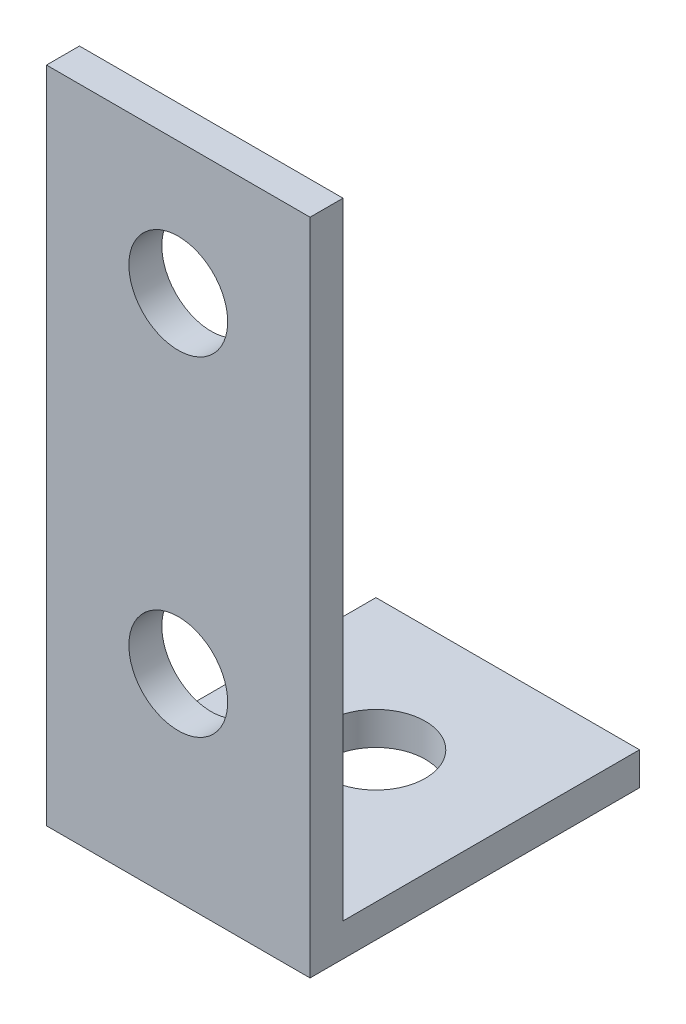
ISO-10303-21;
HEADER;
FILE_DESCRIPTION(('STEP AP214'),'2;1');
FILE_NAME('part.step','',(''),(''),'','','');
FILE_SCHEMA(('AUTOMOTIVE_DESIGN { 1 0 10303 214 1 1 1 1 }'));
ENDSEC;
DATA;
#1=APPLICATION_CONTEXT('core data for automotive mechanical design processes');
#2=APPLICATION_PROTOCOL_DEFINITION('international standard','automotive_design',2000,#1);
#3=PRODUCT_CONTEXT('',#1,'mechanical');
#4=PRODUCT('Part','Part','',(#3));
#5=PRODUCT_RELATED_PRODUCT_CATEGORY('part','',(#4));
#6=PRODUCT_DEFINITION_FORMATION('','',#4);
#7=PRODUCT_DEFINITION_CONTEXT('part definition',#1,'design');
#8=PRODUCT_DEFINITION('design','',#6,#7);
#9=PRODUCT_DEFINITION_SHAPE('','',#8);
#10=(LENGTH_UNIT() NAMED_UNIT(*) SI_UNIT(.MILLI.,.METRE.));
#11=(NAMED_UNIT(*) PLANE_ANGLE_UNIT() SI_UNIT($,.RADIAN.));
#12=(NAMED_UNIT(*) SI_UNIT($,.STERADIAN.) SOLID_ANGLE_UNIT());
#13=UNCERTAINTY_MEASURE_WITH_UNIT(LENGTH_MEASURE(1.E-05),#10,'distance_accuracy_value','');
#14=(GEOMETRIC_REPRESENTATION_CONTEXT(3) GLOBAL_UNCERTAINTY_ASSIGNED_CONTEXT((#13)) GLOBAL_UNIT_ASSIGNED_CONTEXT((#10,
#11,#12)) REPRESENTATION_CONTEXT('',''));
#15=CARTESIAN_POINT('',(0.,0.,0.));
#16=DIRECTION('',(0.,0.,1.));
#17=DIRECTION('',(1.,0.,0.));
#18=AXIS2_PLACEMENT_3D('',#15,#16,#17);
#19=CARTESIAN_POINT('',(8.,20.,0.));
#20=DIRECTION('',(0.,0.,-1.));
#21=DIRECTION('',(-1.,0.,0.));
#22=AXIS2_PLACEMENT_3D('',#19,#20,#21);
#23=PLANE('',#22);
#24=CARTESIAN_POINT('',(4.,16.,0.));
#25=DIRECTION('',(0.,0.,-1.));
#26=DIRECTION('',(0.,1.,0.));
#27=AXIS2_PLACEMENT_3D('',#24,#25,#26);
#28=CIRCLE('',#27,1.5);
#29=CARTESIAN_POINT('',(4.,17.5,0.));
#30=VERTEX_POINT('',#29);
#31=EDGE_CURVE('E183',#30,#30,#28,.T.);
#32=ORIENTED_EDGE('',*,*,#31,.T.);
#33=EDGE_LOOP('',(#32));
#34=FACE_BOUND('',#33,.T.);
#35=CARTESIAN_POINT('',(4.,6.,0.));
#36=DIRECTION('',(0.,0.,-1.));
#37=DIRECTION('',(0.,1.,0.));
#38=AXIS2_PLACEMENT_3D('',#35,#36,#37);
#39=CIRCLE('',#38,1.5);
#40=CARTESIAN_POINT('',(4.,7.5,0.));
#41=VERTEX_POINT('',#40);
#42=EDGE_CURVE('E186',#41,#41,#39,.T.);
#43=ORIENTED_EDGE('',*,*,#42,.T.);
#44=EDGE_LOOP('',(#43));
#45=FACE_BOUND('',#44,.T.);
#46=DIRECTION('',(0.,-1.,0.));
#47=VECTOR('',#46,1.);
#48=CARTESIAN_POINT('',(0.,20.,0.));
#49=LINE('',#48,#47);
#50=CARTESIAN_POINT('',(0.,20.,0.));
#51=VERTEX_POINT('',#50);
#52=CARTESIAN_POINT('',(0.,0.,0.));
#53=VERTEX_POINT('',#52);
#54=EDGE_CURVE('E128',#51,#53,#49,.T.);
#55=ORIENTED_EDGE('',*,*,#54,.T.);
#56=DIRECTION('',(-1.,0.,0.));
#57=VECTOR('',#56,1.);
#58=CARTESIAN_POINT('',(8.,0.,0.));
#59=LINE('',#58,#57);
#60=CARTESIAN_POINT('',(8.,0.,0.));
#61=VERTEX_POINT('',#60);
#62=EDGE_CURVE('E11',#61,#53,#59,.T.);
#63=ORIENTED_EDGE('',*,*,#62,.F.);
#64=DIRECTION('',(0.,-1.,0.));
#65=VECTOR('',#64,1.);
#66=CARTESIAN_POINT('',(8.,20.,0.));
#67=LINE('',#66,#65);
#68=CARTESIAN_POINT('',(8.,20.,0.));
#69=VERTEX_POINT('',#68);
#70=EDGE_CURVE('E145',#69,#61,#67,.T.);
#71=ORIENTED_EDGE('',*,*,#70,.F.);
#72=DIRECTION('',(-1.,0.,0.));
#73=VECTOR('',#72,1.);
#74=CARTESIAN_POINT('',(8.,20.,0.));
#75=LINE('',#74,#73);
#76=EDGE_CURVE('E124',#69,#51,#75,.T.);
#77=ORIENTED_EDGE('',*,*,#76,.T.);
#78=EDGE_LOOP('',(#55,#63,#71,#77));
#79=FACE_BOUND('',#78,.T.);
#80=ADVANCED_FACE('F39',(#34,#45,#79),#23,.F.);
#81=CARTESIAN_POINT('',(8.,0.,0.));
#82=DIRECTION('',(0.,1.,0.));
#83=DIRECTION('',(0.,0.,1.));
#84=AXIS2_PLACEMENT_3D('',#81,#82,#83);
#85=PLANE('',#84);
#86=CARTESIAN_POINT('',(4.,0.,-6.));
#87=DIRECTION('',(0.,1.,0.));
#88=DIRECTION('',(0.,0.,1.));
#89=AXIS2_PLACEMENT_3D('',#86,#87,#88);
#90=CIRCLE('',#89,1.5);
#91=CARTESIAN_POINT('',(4.,0.,-4.5));
#92=VERTEX_POINT('',#91);
#93=EDGE_CURVE('E133',#92,#92,#90,.T.);
#94=ORIENTED_EDGE('',*,*,#93,.T.);
#95=EDGE_LOOP('',(#94));
#96=FACE_BOUND('',#95,.T.);
#97=DIRECTION('',(0.,0.,-1.));
#98=VECTOR('',#97,1.);
#99=CARTESIAN_POINT('',(0.,0.,0.));
#100=LINE('',#99,#98);
#101=CARTESIAN_POINT('',(0.,0.,-10.));
#102=VERTEX_POINT('',#101);
#103=EDGE_CURVE('E132',#53,#102,#100,.T.);
#104=ORIENTED_EDGE('',*,*,#103,.T.);
#105=DIRECTION('',(-1.,0.,0.));
#106=VECTOR('',#105,1.);
#107=CARTESIAN_POINT('',(8.,0.,-10.));
#108=LINE('',#107,#106);
#109=CARTESIAN_POINT('',(8.,0.,-10.));
#110=VERTEX_POINT('',#109);
#111=EDGE_CURVE('E48',#110,#102,#108,.T.);
#112=ORIENTED_EDGE('',*,*,#111,.F.);
#113=DIRECTION('',(0.,0.,-1.));
#114=VECTOR('',#113,1.);
#115=CARTESIAN_POINT('',(8.,0.,0.));
#116=LINE('',#115,#114);
#117=EDGE_CURVE('E93',#61,#110,#116,.T.);
#118=ORIENTED_EDGE('',*,*,#117,.F.);
#119=ORIENTED_EDGE('',*,*,#62,.T.);
#120=EDGE_LOOP('',(#104,#112,#118,#119));
#121=FACE_BOUND('',#120,.T.);
#122=ADVANCED_FACE('F174',(#96,#121),#85,.F.);
#123=CARTESIAN_POINT('',(8.,0.,-10.));
#124=DIRECTION('',(0.,0.,1.));
#125=DIRECTION('',(0.,-1.,0.));
#126=AXIS2_PLACEMENT_3D('',#123,#124,#125);
#127=PLANE('',#126);
#128=DIRECTION('',(0.,1.,0.));
#129=VECTOR('',#128,1.);
#130=CARTESIAN_POINT('',(0.,0.,-10.));
#131=LINE('',#130,#129);
#132=CARTESIAN_POINT('',(0.,1.,-10.));
#133=VERTEX_POINT('',#132);
#134=EDGE_CURVE('E136',#102,#133,#131,.T.);
#135=ORIENTED_EDGE('',*,*,#134,.T.);
#136=DIRECTION('',(-1.,0.,0.));
#137=VECTOR('',#136,1.);
#138=CARTESIAN_POINT('',(8.,1.,-10.));
#139=LINE('',#138,#137);
#140=CARTESIAN_POINT('',(8.,1.,-10.));
#141=VERTEX_POINT('',#140);
#142=EDGE_CURVE('E117',#141,#133,#139,.T.);
#143=ORIENTED_EDGE('',*,*,#142,.F.);
#144=DIRECTION('',(0.,1.,0.));
#145=VECTOR('',#144,1.);
#146=CARTESIAN_POINT('',(8.,0.,-10.));
#147=LINE('',#146,#145);
#148=EDGE_CURVE('E106',#110,#141,#147,.T.);
#149=ORIENTED_EDGE('',*,*,#148,.F.);
#150=ORIENTED_EDGE('',*,*,#111,.T.);
#151=EDGE_LOOP('',(#135,#143,#149,#150));
#152=FACE_BOUND('',#151,.T.);
#153=ADVANCED_FACE('F155',(#152),#127,.F.);
#154=CARTESIAN_POINT('',(8.,1.,-10.));
#155=DIRECTION('',(0.,-1.,0.));
#156=DIRECTION('',(0.,0.,-1.));
#157=AXIS2_PLACEMENT_3D('',#154,#155,#156);
#158=PLANE('',#157);
#159=CARTESIAN_POINT('',(4.,1.,-6.));
#160=DIRECTION('',(0.,1.,0.));
#161=DIRECTION('',(0.,0.,1.));
#162=AXIS2_PLACEMENT_3D('',#159,#160,#161);
#163=CIRCLE('',#162,1.5);
#164=CARTESIAN_POINT('',(4.,1.,-4.5));
#165=VERTEX_POINT('',#164);
#166=EDGE_CURVE('E203',#165,#165,#163,.T.);
#167=ORIENTED_EDGE('',*,*,#166,.F.);
#168=EDGE_LOOP('',(#167));
#169=FACE_BOUND('',#168,.T.);
#170=DIRECTION('',(0.,0.,1.));
#171=VECTOR('',#170,1.);
#172=CARTESIAN_POINT('',(0.,1.,-10.));
#173=LINE('',#172,#171);
#174=CARTESIAN_POINT('',(0.,0.999999999999999,-1.));
#175=VERTEX_POINT('',#174);
#176=EDGE_CURVE('E115',#133,#175,#173,.T.);
#177=ORIENTED_EDGE('',*,*,#176,.T.);
#178=DIRECTION('',(-1.,0.,0.));
#179=VECTOR('',#178,1.);
#180=CARTESIAN_POINT('',(8.,0.999999999999999,-1.));
#181=LINE('',#180,#179);
#182=CARTESIAN_POINT('',(8.,0.999999999999999,-1.));
#183=VERTEX_POINT('',#182);
#184=EDGE_CURVE('E112',#183,#175,#181,.T.);
#185=ORIENTED_EDGE('',*,*,#184,.F.);
#186=DIRECTION('',(0.,0.,1.));
#187=VECTOR('',#186,1.);
#188=CARTESIAN_POINT('',(8.,1.,-10.));
#189=LINE('',#188,#187);
#190=EDGE_CURVE('E100',#141,#183,#189,.T.);
#191=ORIENTED_EDGE('',*,*,#190,.F.);
#192=ORIENTED_EDGE('',*,*,#142,.T.);
#193=EDGE_LOOP('',(#177,#185,#191,#192));
#194=FACE_BOUND('',#193,.T.);
#195=ADVANCED_FACE('F113',(#169,#194),#158,.F.);
#196=CARTESIAN_POINT('',(8.,0.999999999999999,-1.));
#197=DIRECTION('',(0.,0.,1.));
#198=DIRECTION('',(0.,-1.,0.));
#199=AXIS2_PLACEMENT_3D('',#196,#197,#198);
#200=PLANE('',#199);
#201=CARTESIAN_POINT('',(4.,16.,-1.));
#202=DIRECTION('',(0.,0.,-1.));
#203=DIRECTION('',(0.,1.,0.));
#204=AXIS2_PLACEMENT_3D('',#201,#202,#203);
#205=CIRCLE('',#204,1.5);
#206=CARTESIAN_POINT('',(4.,17.5,-1.));
#207=VERTEX_POINT('',#206);
#208=EDGE_CURVE('E189',#207,#207,#205,.T.);
#209=ORIENTED_EDGE('',*,*,#208,.F.);
#210=EDGE_LOOP('',(#209));
#211=FACE_BOUND('',#210,.T.);
#212=CARTESIAN_POINT('',(4.,6.,-1.));
#213=DIRECTION('',(0.,0.,-1.));
#214=DIRECTION('',(0.,1.,0.));
#215=AXIS2_PLACEMENT_3D('',#212,#213,#214);
#216=CIRCLE('',#215,1.5);
#217=CARTESIAN_POINT('',(4.,7.5,-1.));
#218=VERTEX_POINT('',#217);
#219=EDGE_CURVE('E190',#218,#218,#216,.T.);
#220=ORIENTED_EDGE('',*,*,#219,.F.);
#221=EDGE_LOOP('',(#220));
#222=FACE_BOUND('',#221,.T.);
#223=DIRECTION('',(0.,1.,0.));
#224=VECTOR('',#223,1.);
#225=CARTESIAN_POINT('',(0.,0.999999999999999,-1.));
#226=LINE('',#225,#224);
#227=CARTESIAN_POINT('',(0.,20.,-1.));
#228=VERTEX_POINT('',#227);
#229=EDGE_CURVE('E79',#175,#228,#226,.T.);
#230=ORIENTED_EDGE('',*,*,#229,.T.);
#231=DIRECTION('',(-1.,0.,0.));
#232=VECTOR('',#231,1.);
#233=CARTESIAN_POINT('',(8.,20.,-1.));
#234=LINE('',#233,#232);
#235=CARTESIAN_POINT('',(8.,20.,-1.));
#236=VERTEX_POINT('',#235);
#237=EDGE_CURVE('E118',#236,#228,#234,.T.);
#238=ORIENTED_EDGE('',*,*,#237,.F.);
#239=DIRECTION('',(0.,1.,0.));
#240=VECTOR('',#239,1.);
#241=CARTESIAN_POINT('',(8.,0.999999999999999,-1.));
#242=LINE('',#241,#240);
#243=EDGE_CURVE('E104',#183,#236,#242,.T.);
#244=ORIENTED_EDGE('',*,*,#243,.F.);
#245=ORIENTED_EDGE('',*,*,#184,.T.);
#246=EDGE_LOOP('',(#230,#238,#244,#245));
#247=FACE_BOUND('',#246,.T.);
#248=ADVANCED_FACE('F120',(#211,#222,#247),#200,.F.);
#249=CARTESIAN_POINT('',(8.,20.,-1.));
#250=DIRECTION('',(0.,-1.,0.));
#251=DIRECTION('',(0.,0.,-1.));
#252=AXIS2_PLACEMENT_3D('',#249,#250,#251);
#253=PLANE('',#252);
#254=DIRECTION('',(0.,0.,1.));
#255=VECTOR('',#254,1.);
#256=CARTESIAN_POINT('',(0.,20.,-1.));
#257=LINE('',#256,#255);
#258=EDGE_CURVE('E85',#228,#51,#257,.T.);
#259=ORIENTED_EDGE('',*,*,#258,.T.);
#260=ORIENTED_EDGE('',*,*,#76,.F.);
#261=DIRECTION('',(0.,0.,1.));
#262=VECTOR('',#261,1.);
#263=CARTESIAN_POINT('',(8.,20.,-1.));
#264=LINE('',#263,#262);
#265=EDGE_CURVE('E56',#236,#69,#264,.T.);
#266=ORIENTED_EDGE('',*,*,#265,.F.);
#267=ORIENTED_EDGE('',*,*,#237,.T.);
#268=EDGE_LOOP('',(#259,#260,#266,#267));
#269=FACE_BOUND('',#268,.T.);
#270=ADVANCED_FACE('F162',(#269),#253,.F.);
#271=CARTESIAN_POINT('',(8.,0.,0.));
#272=DIRECTION('',(1.,0.,0.));
#273=DIRECTION('',(0.,0.,-1.));
#274=AXIS2_PLACEMENT_3D('',#271,#272,#273);
#275=PLANE('',#274);
#276=ORIENTED_EDGE('',*,*,#70,.T.);
#277=ORIENTED_EDGE('',*,*,#117,.T.);
#278=ORIENTED_EDGE('',*,*,#148,.T.);
#279=ORIENTED_EDGE('',*,*,#190,.T.);
#280=ORIENTED_EDGE('',*,*,#243,.T.);
#281=ORIENTED_EDGE('',*,*,#265,.T.);
#282=EDGE_LOOP('',(#276,#277,#278,#279,#280,#281));
#283=FACE_BOUND('',#282,.T.);
#284=ADVANCED_FACE('F102',(#283),#275,.T.);
#285=CARTESIAN_POINT('',(0.,0.,0.));
#286=DIRECTION('',(1.,0.,0.));
#287=DIRECTION('',(0.,0.,-1.));
#288=AXIS2_PLACEMENT_3D('',#285,#286,#287);
#289=PLANE('',#288);
#290=ORIENTED_EDGE('',*,*,#54,.F.);
#291=ORIENTED_EDGE('',*,*,#258,.F.);
#292=ORIENTED_EDGE('',*,*,#229,.F.);
#293=ORIENTED_EDGE('',*,*,#176,.F.);
#294=ORIENTED_EDGE('',*,*,#134,.F.);
#295=ORIENTED_EDGE('',*,*,#103,.F.);
#296=EDGE_LOOP('',(#290,#291,#292,#293,#294,#295));
#297=FACE_BOUND('',#296,.T.);
#298=ADVANCED_FACE('F158',(#297),#289,.F.);
#299=CARTESIAN_POINT('',(4.,0.,-6.));
#300=DIRECTION('',(0.,1.,0.));
#301=DIRECTION('',(0.,0.,1.));
#302=AXIS2_PLACEMENT_3D('',#299,#300,#301);
#303=CYLINDRICAL_SURFACE('',#302,1.5);
#304=ORIENTED_EDGE('',*,*,#93,.F.);
#305=EDGE_LOOP('',(#304));
#306=FACE_BOUND('',#305,.T.);
#307=ORIENTED_EDGE('',*,*,#166,.T.);
#308=EDGE_LOOP('',(#307));
#309=FACE_BOUND('',#308,.T.);
#310=ADVANCED_FACE('F214',(#306,#309),#303,.F.);
#311=CARTESIAN_POINT('',(4.,6.,0.));
#312=DIRECTION('',(0.,0.,-1.));
#313=DIRECTION('',(0.,1.,0.));
#314=AXIS2_PLACEMENT_3D('',#311,#312,#313);
#315=CYLINDRICAL_SURFACE('',#314,1.5);
#316=ORIENTED_EDGE('',*,*,#42,.F.);
#317=EDGE_LOOP('',(#316));
#318=FACE_BOUND('',#317,.T.);
#319=ORIENTED_EDGE('',*,*,#219,.T.);
#320=EDGE_LOOP('',(#319));
#321=FACE_BOUND('',#320,.T.);
#322=ADVANCED_FACE('F247',(#318,#321),#315,.F.);
#323=CARTESIAN_POINT('',(4.,16.,0.));
#324=DIRECTION('',(0.,0.,-1.));
#325=DIRECTION('',(0.,1.,0.));
#326=AXIS2_PLACEMENT_3D('',#323,#324,#325);
#327=CYLINDRICAL_SURFACE('',#326,1.5);
#328=ORIENTED_EDGE('',*,*,#31,.F.);
#329=EDGE_LOOP('',(#328));
#330=FACE_BOUND('',#329,.T.);
#331=ORIENTED_EDGE('',*,*,#208,.T.);
#332=EDGE_LOOP('',(#331));
#333=FACE_BOUND('',#332,.T.);
#334=ADVANCED_FACE('F267',(#330,#333),#327,.F.);
#335=CLOSED_SHELL('',(#80,#122,#153,#195,#248,#270,#284,#298,#310,#322,#334));
#336=MANIFOLD_SOLID_BREP('B2',#335);
#337=ADVANCED_BREP_SHAPE_REPRESENTATION('',(#18,#336),#14);
#338=SHAPE_DEFINITION_REPRESENTATION(#9,#337);
ENDSEC;
END-ISO-10303-21;
